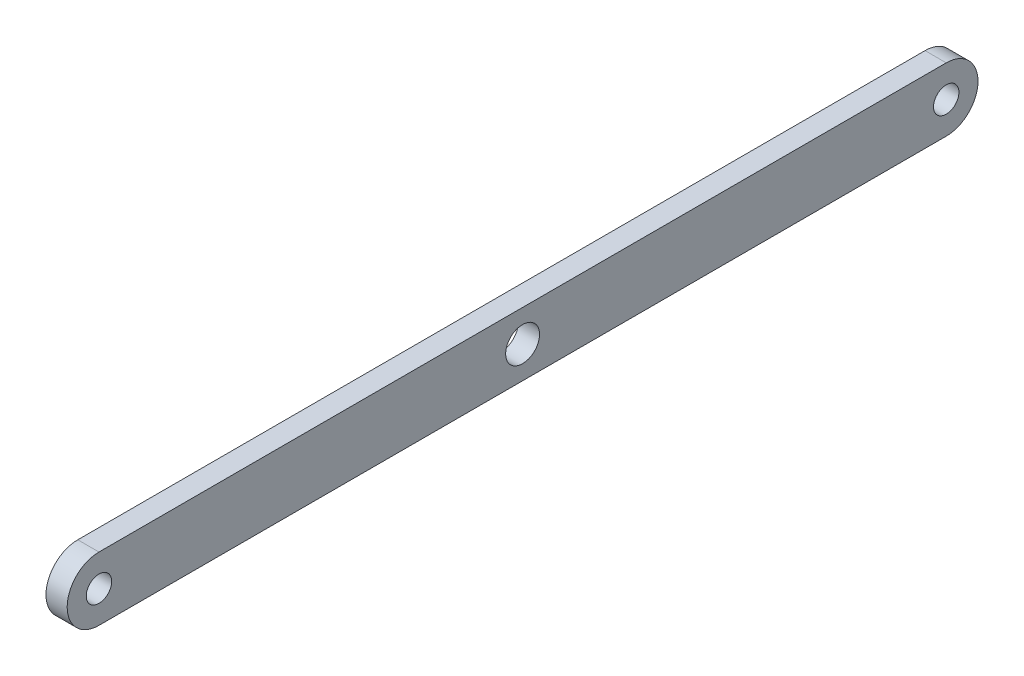
ISO-10303-21;
HEADER;
FILE_DESCRIPTION(('STEP AP214'),'2;1');
FILE_NAME('part.step','',(''),(''),'','','');
FILE_SCHEMA(('AUTOMOTIVE_DESIGN { 1 0 10303 214 1 1 1 1 }'));
ENDSEC;
DATA;
#1=APPLICATION_CONTEXT('core data for automotive mechanical design processes');
#2=APPLICATION_PROTOCOL_DEFINITION('international standard','automotive_design',2000,#1);
#3=PRODUCT_CONTEXT('',#1,'mechanical');
#4=PRODUCT('Part','Part','',(#3));
#5=PRODUCT_RELATED_PRODUCT_CATEGORY('part','',(#4));
#6=PRODUCT_DEFINITION_FORMATION('','',#4);
#7=PRODUCT_DEFINITION_CONTEXT('part definition',#1,'design');
#8=PRODUCT_DEFINITION('design','',#6,#7);
#9=PRODUCT_DEFINITION_SHAPE('','',#8);
#10=(LENGTH_UNIT() NAMED_UNIT(*) SI_UNIT(.MILLI.,.METRE.));
#11=(NAMED_UNIT(*) PLANE_ANGLE_UNIT() SI_UNIT($,.RADIAN.));
#12=(NAMED_UNIT(*) SI_UNIT($,.STERADIAN.) SOLID_ANGLE_UNIT());
#13=UNCERTAINTY_MEASURE_WITH_UNIT(LENGTH_MEASURE(1.E-05),#10,'distance_accuracy_value','');
#14=(GEOMETRIC_REPRESENTATION_CONTEXT(3) GLOBAL_UNCERTAINTY_ASSIGNED_CONTEXT((#13)) GLOBAL_UNIT_ASSIGNED_CONTEXT((#10,
#11,#12)) REPRESENTATION_CONTEXT('',''));
#15=CARTESIAN_POINT('',(0.,0.,0.));
#16=DIRECTION('',(0.,0.,1.));
#17=DIRECTION('',(1.,0.,0.));
#18=AXIS2_PLACEMENT_3D('',#15,#16,#17);
#19=CARTESIAN_POINT('',(5.,-7.49999999999998,0.));
#20=DIRECTION('',(0.,1.,0.));
#21=DIRECTION('',(0.,0.,1.));
#22=AXIS2_PLACEMENT_3D('',#19,#20,#21);
#23=PLANE('',#22);
#24=DIRECTION('',(0.,0.,-1.));
#25=VECTOR('',#24,1.);
#26=CARTESIAN_POINT('',(0.,-7.49999999999998,0.));
#27=LINE('',#26,#25);
#28=CARTESIAN_POINT('',(0.,-7.5,100.));
#29=VERTEX_POINT('',#28);
#30=CARTESIAN_POINT('',(0.,-7.49999999999996,-100.));
#31=VERTEX_POINT('',#30);
#32=EDGE_CURVE('E108',#29,#31,#27,.T.);
#33=ORIENTED_EDGE('',*,*,#32,.T.);
#34=DIRECTION('',(-1.,0.,0.));
#35=VECTOR('',#34,1.);
#36=CARTESIAN_POINT('',(5.,-7.49999999999996,-100.));
#37=LINE('',#36,#35);
#38=CARTESIAN_POINT('',(5.,-7.49999999999996,-100.));
#39=VERTEX_POINT('',#38);
#40=EDGE_CURVE('E11',#39,#31,#37,.T.);
#41=ORIENTED_EDGE('',*,*,#40,.F.);
#42=DIRECTION('',(0.,0.,-1.));
#43=VECTOR('',#42,1.);
#44=CARTESIAN_POINT('',(5.,-7.49999999999998,0.));
#45=LINE('',#44,#43);
#46=CARTESIAN_POINT('',(5.,-7.5,100.));
#47=VERTEX_POINT('',#46);
#48=EDGE_CURVE('E84',#47,#39,#45,.T.);
#49=ORIENTED_EDGE('',*,*,#48,.F.);
#50=DIRECTION('',(-1.,0.,0.));
#51=VECTOR('',#50,1.);
#52=CARTESIAN_POINT('',(5.,-7.5,100.));
#53=LINE('',#52,#51);
#54=EDGE_CURVE('E95',#47,#29,#53,.T.);
#55=ORIENTED_EDGE('',*,*,#54,.T.);
#56=EDGE_LOOP('',(#33,#41,#49,#55));
#57=FACE_BOUND('',#56,.T.);
#58=ADVANCED_FACE('F36',(#57),#23,.F.);
#59=CARTESIAN_POINT('',(5.,0.,-100.));
#60=DIRECTION('',(-1.,0.,0.));
#61=DIRECTION('',(0.,0.,1.));
#62=AXIS2_PLACEMENT_3D('',#59,#60,#61);
#63=CYLINDRICAL_SURFACE('',#62,7.5);
#64=CARTESIAN_POINT('',(0.,0.,-100.));
#65=DIRECTION('',(1.,0.,0.));
#66=DIRECTION('',(0.,0.,-1.));
#67=AXIS2_PLACEMENT_3D('',#64,#65,#66);
#68=CIRCLE('',#67,7.5);
#69=CARTESIAN_POINT('',(0.,7.50000000000004,-100.));
#70=VERTEX_POINT('',#69);
#71=EDGE_CURVE('E89',#31,#70,#68,.T.);
#72=ORIENTED_EDGE('',*,*,#71,.T.);
#73=DIRECTION('',(-1.,0.,0.));
#74=VECTOR('',#73,1.);
#75=CARTESIAN_POINT('',(5.,7.50000000000004,-100.));
#76=LINE('',#75,#74);
#77=CARTESIAN_POINT('',(5.,7.50000000000004,-100.));
#78=VERTEX_POINT('',#77);
#79=EDGE_CURVE('E45',#78,#70,#76,.T.);
#80=ORIENTED_EDGE('',*,*,#79,.F.);
#81=CARTESIAN_POINT('',(5.,0.,-100.));
#82=DIRECTION('',(1.,0.,0.));
#83=DIRECTION('',(0.,0.,-1.));
#84=AXIS2_PLACEMENT_3D('',#81,#82,#83);
#85=CIRCLE('',#84,7.5);
#86=EDGE_CURVE('E79',#39,#78,#85,.T.);
#87=ORIENTED_EDGE('',*,*,#86,.F.);
#88=ORIENTED_EDGE('',*,*,#40,.T.);
#89=EDGE_LOOP('',(#72,#80,#87,#88));
#90=FACE_BOUND('',#89,.T.);
#91=ADVANCED_FACE('F88',(#90),#63,.T.);
#92=CARTESIAN_POINT('',(5.,7.50000000000002,0.));
#93=DIRECTION('',(0.,1.,0.));
#94=DIRECTION('',(0.,0.,1.));
#95=AXIS2_PLACEMENT_3D('',#92,#93,#94);
#96=PLANE('',#95);
#97=DIRECTION('',(0.,0.,-1.));
#98=VECTOR('',#97,1.);
#99=CARTESIAN_POINT('',(0.,7.50000000000002,0.));
#100=LINE('',#99,#98);
#101=CARTESIAN_POINT('',(0.,7.5,100.));
#102=VERTEX_POINT('',#101);
#103=EDGE_CURVE('E112',#102,#70,#100,.T.);
#104=ORIENTED_EDGE('',*,*,#103,.F.);
#105=DIRECTION('',(-1.,0.,0.));
#106=VECTOR('',#105,1.);
#107=CARTESIAN_POINT('',(5.,7.5,100.));
#108=LINE('',#107,#106);
#109=CARTESIAN_POINT('',(5.,7.5,100.));
#110=VERTEX_POINT('',#109);
#111=EDGE_CURVE('E69',#110,#102,#108,.T.);
#112=ORIENTED_EDGE('',*,*,#111,.F.);
#113=DIRECTION('',(0.,0.,-1.));
#114=VECTOR('',#113,1.);
#115=CARTESIAN_POINT('',(5.,7.50000000000002,0.));
#116=LINE('',#115,#114);
#117=EDGE_CURVE('E82',#110,#78,#116,.T.);
#118=ORIENTED_EDGE('',*,*,#117,.T.);
#119=ORIENTED_EDGE('',*,*,#79,.T.);
#120=EDGE_LOOP('',(#104,#112,#118,#119));
#121=FACE_BOUND('',#120,.T.);
#122=ADVANCED_FACE('F93',(#121),#96,.T.);
#123=CARTESIAN_POINT('',(5.,0.,100.));
#124=DIRECTION('',(-1.,0.,0.));
#125=DIRECTION('',(0.,0.,1.));
#126=AXIS2_PLACEMENT_3D('',#123,#124,#125);
#127=CYLINDRICAL_SURFACE('',#126,3.00000000000001);
#128=CARTESIAN_POINT('',(5.,0.,100.));
#129=DIRECTION('',(1.,0.,0.));
#130=DIRECTION('',(0.,0.,-1.));
#131=AXIS2_PLACEMENT_3D('',#128,#129,#130);
#132=CIRCLE('',#131,3.00000000000001);
#133=CARTESIAN_POINT('',(5.,0.,97.));
#134=VERTEX_POINT('',#133);
#135=EDGE_CURVE('E159',#134,#134,#132,.T.);
#136=ORIENTED_EDGE('',*,*,#135,.T.);
#137=EDGE_LOOP('',(#136));
#138=FACE_BOUND('',#137,.T.);
#139=CARTESIAN_POINT('',(0.,0.,100.));
#140=DIRECTION('',(1.,0.,0.));
#141=DIRECTION('',(0.,0.,-1.));
#142=AXIS2_PLACEMENT_3D('',#139,#140,#141);
#143=CIRCLE('',#142,3.00000000000001);
#144=CARTESIAN_POINT('',(0.,0.,97.));
#145=VERTEX_POINT('',#144);
#146=EDGE_CURVE('E105',#145,#145,#143,.T.);
#147=ORIENTED_EDGE('',*,*,#146,.F.);
#148=EDGE_LOOP('',(#147));
#149=FACE_BOUND('',#148,.T.);
#150=ADVANCED_FACE('F140',(#138,#149),#127,.F.);
#151=CARTESIAN_POINT('',(5.,0.,-100.));
#152=DIRECTION('',(-1.,0.,0.));
#153=DIRECTION('',(0.,0.,1.));
#154=AXIS2_PLACEMENT_3D('',#151,#152,#153);
#155=CYLINDRICAL_SURFACE('',#154,3.00000000000001);
#156=CARTESIAN_POINT('',(5.,0.,-100.));
#157=DIRECTION('',(1.,0.,0.));
#158=DIRECTION('',(0.,0.,-1.));
#159=AXIS2_PLACEMENT_3D('',#156,#157,#158);
#160=CIRCLE('',#159,3.00000000000001);
#161=CARTESIAN_POINT('',(5.,0.,-103.));
#162=VERTEX_POINT('',#161);
#163=EDGE_CURVE('E153',#162,#162,#160,.T.);
#164=ORIENTED_EDGE('',*,*,#163,.T.);
#165=EDGE_LOOP('',(#164));
#166=FACE_BOUND('',#165,.T.);
#167=CARTESIAN_POINT('',(0.,0.,-100.));
#168=DIRECTION('',(1.,0.,0.));
#169=DIRECTION('',(0.,0.,-1.));
#170=AXIS2_PLACEMENT_3D('',#167,#168,#169);
#171=CIRCLE('',#170,3.00000000000001);
#172=CARTESIAN_POINT('',(0.,0.,-103.));
#173=VERTEX_POINT('',#172);
#174=EDGE_CURVE('E102',#173,#173,#171,.T.);
#175=ORIENTED_EDGE('',*,*,#174,.F.);
#176=EDGE_LOOP('',(#175));
#177=FACE_BOUND('',#176,.T.);
#178=ADVANCED_FACE('F142',(#166,#177),#155,.F.);
#179=CARTESIAN_POINT('',(5.,0.,0.));
#180=DIRECTION('',(-1.,0.,0.));
#181=DIRECTION('',(0.,0.,1.));
#182=AXIS2_PLACEMENT_3D('',#179,#180,#181);
#183=CYLINDRICAL_SURFACE('',#182,4.);
#184=CARTESIAN_POINT('',(5.,0.,0.));
#185=DIRECTION('',(1.,0.,0.));
#186=DIRECTION('',(0.,0.,-1.));
#187=AXIS2_PLACEMENT_3D('',#184,#185,#186);
#188=CIRCLE('',#187,4.);
#189=CARTESIAN_POINT('',(5.,0.,-4.));
#190=VERTEX_POINT('',#189);
#191=EDGE_CURVE('E115',#190,#190,#188,.T.);
#192=ORIENTED_EDGE('',*,*,#191,.T.);
#193=EDGE_LOOP('',(#192));
#194=FACE_BOUND('',#193,.T.);
#195=CARTESIAN_POINT('',(0.,0.,0.));
#196=DIRECTION('',(1.,0.,0.));
#197=DIRECTION('',(0.,0.,-1.));
#198=AXIS2_PLACEMENT_3D('',#195,#196,#197);
#199=CIRCLE('',#198,4.);
#200=CARTESIAN_POINT('',(0.,0.,-4.));
#201=VERTEX_POINT('',#200);
#202=EDGE_CURVE('E99',#201,#201,#199,.T.);
#203=ORIENTED_EDGE('',*,*,#202,.F.);
#204=EDGE_LOOP('',(#203));
#205=FACE_BOUND('',#204,.T.);
#206=ADVANCED_FACE('F38',(#194,#205),#183,.F.);
#207=CARTESIAN_POINT('',(5.,0.,100.));
#208=DIRECTION('',(-1.,0.,0.));
#209=DIRECTION('',(0.,0.,1.));
#210=AXIS2_PLACEMENT_3D('',#207,#208,#209);
#211=CYLINDRICAL_SURFACE('',#210,7.5);
#212=CARTESIAN_POINT('',(0.,0.,100.));
#213=DIRECTION('',(1.,0.,0.));
#214=DIRECTION('',(0.,0.,-1.));
#215=AXIS2_PLACEMENT_3D('',#212,#213,#214);
#216=CIRCLE('',#215,7.5);
#217=EDGE_CURVE('E72',#102,#29,#216,.T.);
#218=ORIENTED_EDGE('',*,*,#217,.T.);
#219=ORIENTED_EDGE('',*,*,#54,.F.);
#220=CARTESIAN_POINT('',(5.,0.,100.));
#221=DIRECTION('',(1.,0.,0.));
#222=DIRECTION('',(0.,0.,-1.));
#223=AXIS2_PLACEMENT_3D('',#220,#221,#222);
#224=CIRCLE('',#223,7.5);
#225=EDGE_CURVE('E53',#110,#47,#224,.T.);
#226=ORIENTED_EDGE('',*,*,#225,.F.);
#227=ORIENTED_EDGE('',*,*,#111,.T.);
#228=EDGE_LOOP('',(#218,#219,#226,#227));
#229=FACE_BOUND('',#228,.T.);
#230=ADVANCED_FACE('F127',(#229),#211,.T.);
#231=CARTESIAN_POINT('',(5.,0.,0.));
#232=DIRECTION('',(1.,0.,0.));
#233=DIRECTION('',(0.,0.,-1.));
#234=AXIS2_PLACEMENT_3D('',#231,#232,#233);
#235=PLANE('',#234);
#236=ORIENTED_EDGE('',*,*,#191,.F.);
#237=EDGE_LOOP('',(#236));
#238=FACE_BOUND('',#237,.T.);
#239=ORIENTED_EDGE('',*,*,#163,.F.);
#240=EDGE_LOOP('',(#239));
#241=FACE_BOUND('',#240,.T.);
#242=ORIENTED_EDGE('',*,*,#135,.F.);
#243=EDGE_LOOP('',(#242));
#244=FACE_BOUND('',#243,.T.);
#245=ORIENTED_EDGE('',*,*,#48,.T.);
#246=ORIENTED_EDGE('',*,*,#86,.T.);
#247=ORIENTED_EDGE('',*,*,#117,.F.);
#248=ORIENTED_EDGE('',*,*,#225,.T.);
#249=EDGE_LOOP('',(#245,#246,#247,#248));
#250=FACE_BOUND('',#249,.T.);
#251=ADVANCED_FACE('F80',(#238,#241,#244,#250),#235,.T.);
#252=CARTESIAN_POINT('',(0.,0.,0.));
#253=DIRECTION('',(1.,0.,0.));
#254=DIRECTION('',(0.,0.,-1.));
#255=AXIS2_PLACEMENT_3D('',#252,#253,#254);
#256=PLANE('',#255);
#257=ORIENTED_EDGE('',*,*,#202,.T.);
#258=EDGE_LOOP('',(#257));
#259=FACE_BOUND('',#258,.T.);
#260=ORIENTED_EDGE('',*,*,#174,.T.);
#261=EDGE_LOOP('',(#260));
#262=FACE_BOUND('',#261,.T.);
#263=ORIENTED_EDGE('',*,*,#146,.T.);
#264=EDGE_LOOP('',(#263));
#265=FACE_BOUND('',#264,.T.);
#266=ORIENTED_EDGE('',*,*,#32,.F.);
#267=ORIENTED_EDGE('',*,*,#217,.F.);
#268=ORIENTED_EDGE('',*,*,#103,.T.);
#269=ORIENTED_EDGE('',*,*,#71,.F.);
#270=EDGE_LOOP('',(#266,#267,#268,#269));
#271=FACE_BOUND('',#270,.T.);
#272=ADVANCED_FACE('F120',(#259,#262,#265,#271),#256,.F.);
#273=CLOSED_SHELL('',(#58,#91,#122,#150,#178,#206,#230,#251,#272));
#274=MANIFOLD_SOLID_BREP('B2',#273);
#275=ADVANCED_BREP_SHAPE_REPRESENTATION('',(#18,#274),#14);
#276=SHAPE_DEFINITION_REPRESENTATION(#9,#275);
ENDSEC;
END-ISO-10303-21;
